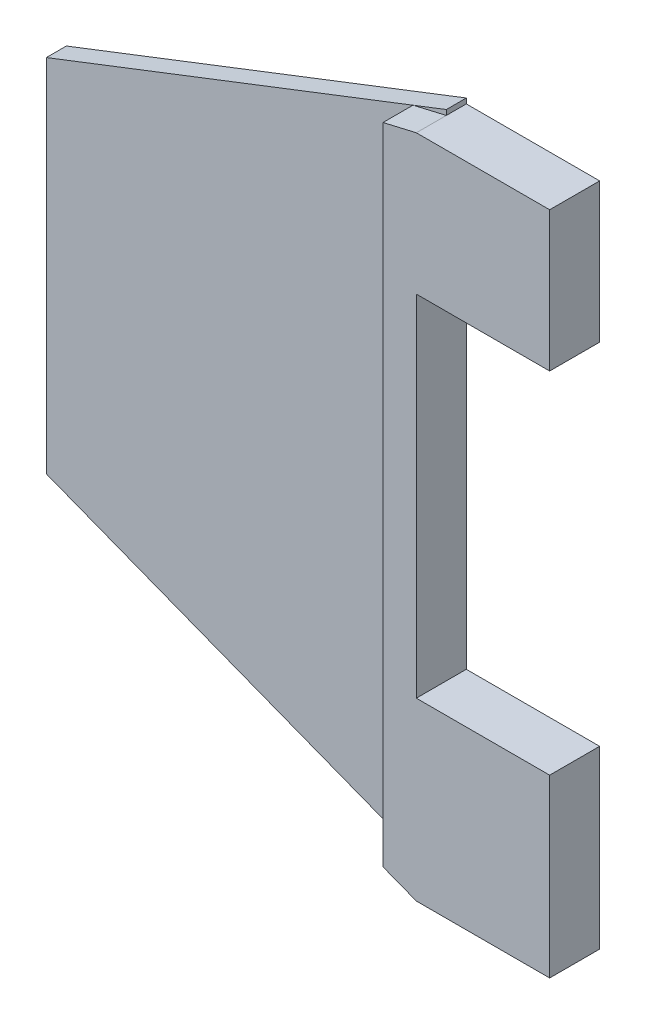
ISO-10303-21;
HEADER;
FILE_DESCRIPTION(('STEP AP214'),'2;1');
FILE_NAME('part.step','',(''),(''),'','','');
FILE_SCHEMA(('AUTOMOTIVE_DESIGN { 1 0 10303 214 1 1 1 1 }'));
ENDSEC;
DATA;
#1=APPLICATION_CONTEXT('core data for automotive mechanical design processes');
#2=APPLICATION_PROTOCOL_DEFINITION('international standard','automotive_design',2000,#1);
#3=PRODUCT_CONTEXT('',#1,'mechanical');
#4=PRODUCT('Part','Part','',(#3));
#5=PRODUCT_RELATED_PRODUCT_CATEGORY('part','',(#4));
#6=PRODUCT_DEFINITION_FORMATION('','',#4);
#7=PRODUCT_DEFINITION_CONTEXT('part definition',#1,'design');
#8=PRODUCT_DEFINITION('design','',#6,#7);
#9=PRODUCT_DEFINITION_SHAPE('','',#8);
#10=(LENGTH_UNIT() NAMED_UNIT(*) SI_UNIT(.MILLI.,.METRE.));
#11=(NAMED_UNIT(*) PLANE_ANGLE_UNIT() SI_UNIT($,.RADIAN.));
#12=(NAMED_UNIT(*) SI_UNIT($,.STERADIAN.) SOLID_ANGLE_UNIT());
#13=UNCERTAINTY_MEASURE_WITH_UNIT(LENGTH_MEASURE(1.E-05),#10,'distance_accuracy_value','');
#14=(GEOMETRIC_REPRESENTATION_CONTEXT(3) GLOBAL_UNCERTAINTY_ASSIGNED_CONTEXT((#13)) GLOBAL_UNIT_ASSIGNED_CONTEXT((#10,
#11,#12)) REPRESENTATION_CONTEXT('',''));
#15=CARTESIAN_POINT('',(0.,0.,0.));
#16=DIRECTION('',(0.,0.,1.));
#17=DIRECTION('',(1.,0.,0.));
#18=AXIS2_PLACEMENT_3D('',#15,#16,#17);
#19=CARTESIAN_POINT('',(24.8669295287806,20.098165537934,1.2));
#20=DIRECTION('',(1.,0.,0.));
#21=DIRECTION('',(0.,1.,0.));
#22=AXIS2_PLACEMENT_3D('',#19,#20,#21);
#23=PLANE('',#22);
#24=DIRECTION('',(0.,0.,-1.));
#25=VECTOR('',#24,1.);
#26=CARTESIAN_POINT('',(24.8669295287806,19.7895662368112,3.));
#27=LINE('',#26,#25);
#28=CARTESIAN_POINT('',(24.8669295287806,19.7895662368112,1.2));
#29=VERTEX_POINT('',#28);
#30=CARTESIAN_POINT('',(24.8669295287806,19.7895662368112,0.));
#31=VERTEX_POINT('',#30);
#32=EDGE_CURVE('E207',#29,#31,#27,.T.);
#33=ORIENTED_EDGE('',*,*,#32,.T.);
#34=DIRECTION('',(0.,-1.,0.));
#35=VECTOR('',#34,1.);
#36=CARTESIAN_POINT('',(24.8669295287806,20.098165537934,0.));
#37=LINE('',#36,#35);
#38=CARTESIAN_POINT('',(24.8669295287806,20.098165537934,0.));
#39=VERTEX_POINT('',#38);
#40=EDGE_CURVE('E240',#39,#31,#37,.T.);
#41=ORIENTED_EDGE('',*,*,#40,.F.);
#42=DIRECTION('',(0.,0.,-1.));
#43=VECTOR('',#42,1.);
#44=CARTESIAN_POINT('',(24.8669295287806,20.098165537934,1.2));
#45=LINE('',#44,#43);
#46=CARTESIAN_POINT('',(24.8669295287806,20.098165537934,1.2));
#47=VERTEX_POINT('',#46);
#48=EDGE_CURVE('E244',#47,#39,#45,.T.);
#49=ORIENTED_EDGE('',*,*,#48,.F.);
#50=DIRECTION('',(0.,-1.,0.));
#51=VECTOR('',#50,1.);
#52=CARTESIAN_POINT('',(24.8669295287806,20.098165537934,1.2));
#53=LINE('',#52,#51);
#54=EDGE_CURVE('E230',#47,#29,#53,.T.);
#55=ORIENTED_EDGE('',*,*,#54,.T.);
#56=EDGE_LOOP('',(#33,#41,#49,#55));
#57=FACE_BOUND('',#56,.T.);
#58=ADVANCED_FACE('F35',(#57),#23,.T.);
#59=CARTESIAN_POINT('',(0.,0.,1.2));
#60=DIRECTION('',(0.,0.,1.));
#61=DIRECTION('',(1.,0.,0.));
#62=AXIS2_PLACEMENT_3D('',#59,#60,#61);
#63=PLANE('',#62);
#64=DIRECTION('',(-0.973876556238657,-0.227078077340667,0.));
#65=VECTOR('',#64,1.);
#66=CARTESIAN_POINT('',(-3.09413410667259,13.2699056801782,1.2));
#67=LINE('',#66,#65);
#68=CARTESIAN_POINT('',(22.8669295287806,19.3232277139543,1.2));
#69=VERTEX_POINT('',#68);
#70=EDGE_CURVE('E224',#29,#69,#67,.T.);
#71=ORIENTED_EDGE('',*,*,#70,.F.);
#72=ORIENTED_EDGE('',*,*,#54,.F.);
#73=DIRECTION('',(0.932451231229654,0.361295864048156,0.));
#74=VECTOR('',#73,1.);
#75=CARTESIAN_POINT('',(0.866929528780555,10.7989116501775,1.2));
#76=LINE('',#75,#74);
#77=EDGE_CURVE('E233',#69,#47,#76,.T.);
#78=ORIENTED_EDGE('',*,*,#77,.F.);
#79=EDGE_LOOP('',(#71,#72,#78));
#80=FACE_BOUND('',#79,.T.);
#81=ADVANCED_FACE('F277',(#80),#63,.T.);
#82=CARTESIAN_POINT('',(0.866929528780555,10.7989116501775,1.2));
#83=DIRECTION('',(1.,0.,0.));
#84=DIRECTION('',(0.,0.,-1.));
#85=AXIS2_PLACEMENT_3D('',#82,#83,#84);
#86=PLANE('',#85);
#87=DIRECTION('',(0.,-1.,0.));
#88=VECTOR('',#87,1.);
#89=CARTESIAN_POINT('',(0.866929528780555,10.7989116501775,0.));
#90=LINE('',#89,#88);
#91=CARTESIAN_POINT('',(0.866929528780555,10.7989116501775,0.));
#92=VERTEX_POINT('',#91);
#93=CARTESIAN_POINT('',(0.866929528780555,-10.8337620445631,0.));
#94=VERTEX_POINT('',#93);
#95=EDGE_CURVE('E226',#92,#94,#90,.T.);
#96=ORIENTED_EDGE('',*,*,#95,.T.);
#97=DIRECTION('',(0.,0.,-1.));
#98=VECTOR('',#97,1.);
#99=CARTESIAN_POINT('',(0.866929528780555,-10.8337620445631,1.2));
#100=LINE('',#99,#98);
#101=CARTESIAN_POINT('',(0.866929528780555,-10.8337620445631,1.2));
#102=VERTEX_POINT('',#101);
#103=EDGE_CURVE('E11',#102,#94,#100,.T.);
#104=ORIENTED_EDGE('',*,*,#103,.F.);
#105=DIRECTION('',(0.,-1.,0.));
#106=VECTOR('',#105,1.);
#107=CARTESIAN_POINT('',(0.866929528780555,10.7989116501775,1.2));
#108=LINE('',#107,#106);
#109=CARTESIAN_POINT('',(0.866929528780555,10.7989116501775,1.2));
#110=VERTEX_POINT('',#109);
#111=EDGE_CURVE('E227',#110,#102,#108,.T.);
#112=ORIENTED_EDGE('',*,*,#111,.F.);
#113=DIRECTION('',(0.,0.,-1.));
#114=VECTOR('',#113,1.);
#115=CARTESIAN_POINT('',(0.866929528780555,10.7989116501775,1.2));
#116=LINE('',#115,#114);
#117=EDGE_CURVE('E52',#110,#92,#116,.T.);
#118=ORIENTED_EDGE('',*,*,#117,.T.);
#119=EDGE_LOOP('',(#96,#104,#112,#118));
#120=FACE_BOUND('',#119,.T.);
#121=ADVANCED_FACE('F37',(#120),#86,.F.);
#122=CARTESIAN_POINT('',(0.866929528780555,-10.8337620445631,1.2));
#123=DIRECTION('',(0.361295864048155,0.932451231229653,0.));
#124=DIRECTION('',(-0.932451231229654,0.361295864048155,0.));
#125=AXIS2_PLACEMENT_3D('',#122,#123,#124);
#126=PLANE('',#125);
#127=DIRECTION('',(0.932451231229654,-0.361295864048155,0.));
#128=VECTOR('',#127,1.);
#129=CARTESIAN_POINT('',(0.866929528780555,-10.8337620445631,0.));
#130=LINE('',#129,#128);
#131=CARTESIAN_POINT('',(24.8669295287806,-20.1330159323197,0.));
#132=VERTEX_POINT('',#131);
#133=EDGE_CURVE('E237',#94,#132,#130,.T.);
#134=ORIENTED_EDGE('',*,*,#133,.T.);
#135=DIRECTION('',(0.,0.,-1.));
#136=VECTOR('',#135,1.);
#137=CARTESIAN_POINT('',(24.8669295287806,-20.1330159323197,1.2));
#138=LINE('',#137,#136);
#139=CARTESIAN_POINT('',(24.8669295287806,-20.1330159323197,3.));
#140=VERTEX_POINT('',#139);
#141=EDGE_CURVE('E44',#140,#132,#138,.T.);
#142=ORIENTED_EDGE('',*,*,#141,.F.);
#143=DIRECTION('',(-0.932451231229653,0.361295864048156,0.));
#144=VECTOR('',#143,1.);
#145=CARTESIAN_POINT('',(22.8669295287806,-19.35807810834,3.));
#146=LINE('',#145,#144);
#147=CARTESIAN_POINT('',(22.8669295287806,-19.35807810834,3.));
#148=VERTEX_POINT('',#147);
#149=EDGE_CURVE('E187',#140,#148,#146,.T.);
#150=ORIENTED_EDGE('',*,*,#149,.T.);
#151=DIRECTION('',(0.,0.,-1.));
#152=VECTOR('',#151,1.);
#153=CARTESIAN_POINT('',(22.8669295287806,-19.35807810834,3.));
#154=LINE('',#153,#152);
#155=CARTESIAN_POINT('',(22.8669295287806,-19.35807810834,1.2));
#156=VERTEX_POINT('',#155);
#157=EDGE_CURVE('E211',#148,#156,#154,.T.);
#158=ORIENTED_EDGE('',*,*,#157,.T.);
#159=DIRECTION('',(0.932451231229654,-0.361295864048155,0.));
#160=VECTOR('',#159,1.);
#161=CARTESIAN_POINT('',(0.866929528780555,-10.8337620445631,1.2));
#162=LINE('',#161,#160);
#163=EDGE_CURVE('E75',#102,#156,#162,.T.);
#164=ORIENTED_EDGE('',*,*,#163,.F.);
#165=ORIENTED_EDGE('',*,*,#103,.T.);
#166=EDGE_LOOP('',(#134,#142,#150,#158,#164,#165));
#167=FACE_BOUND('',#166,.T.);
#168=ADVANCED_FACE('F259',(#167),#126,.F.);
#169=DIRECTION('',(0.,0.,-1.));
#170=VECTOR('',#169,1.);
#171=CARTESIAN_POINT('',(24.8669295287806,-9.59204114150225,3.));
#172=LINE('',#171,#170);
#173=CARTESIAN_POINT('',(24.8669295287806,-9.59204114150225,3.));
#174=VERTEX_POINT('',#173);
#175=CARTESIAN_POINT('',(24.8669295287806,-9.59204114150225,0.));
#176=VERTEX_POINT('',#175);
#177=EDGE_CURVE('E217',#174,#176,#172,.T.);
#178=ORIENTED_EDGE('',*,*,#177,.T.);
#179=CARTESIAN_POINT('',(24.8669295287806,11.4079588584978,0.));
#180=VERTEX_POINT('',#179);
#181=EDGE_CURVE('E239',#180,#176,#37,.T.);
#182=ORIENTED_EDGE('',*,*,#181,.F.);
#183=DIRECTION('',(0.,0.,-1.));
#184=VECTOR('',#183,1.);
#185=CARTESIAN_POINT('',(24.8669295287806,11.4079588584978,3.));
#186=LINE('',#185,#184);
#187=CARTESIAN_POINT('',(24.8669295287806,11.4079588584978,3.));
#188=VERTEX_POINT('',#187);
#189=EDGE_CURVE('E220',#188,#180,#186,.T.);
#190=ORIENTED_EDGE('',*,*,#189,.F.);
#191=DIRECTION('',(0.,-1.,0.));
#192=VECTOR('',#191,1.);
#193=CARTESIAN_POINT('',(24.8669295287806,-9.59204114150225,3.));
#194=LINE('',#193,#192);
#195=EDGE_CURVE('E175',#188,#174,#194,.T.);
#196=ORIENTED_EDGE('',*,*,#195,.T.);
#197=EDGE_LOOP('',(#178,#182,#190,#196));
#198=FACE_BOUND('',#197,.T.);
#199=ADVANCED_FACE('F285',(#198),#23,.T.);
#200=CARTESIAN_POINT('',(0.866929528780555,10.7989116501775,1.2));
#201=DIRECTION('',(-0.361295864048155,0.932451231229653,0.));
#202=DIRECTION('',(-0.932451231229654,-0.361295864048156,0.));
#203=AXIS2_PLACEMENT_3D('',#200,#201,#202);
#204=PLANE('',#203);
#205=EDGE_CURVE('E234',#110,#69,#76,.T.);
#206=ORIENTED_EDGE('',*,*,#205,.T.);
#207=ORIENTED_EDGE('',*,*,#77,.T.);
#208=ORIENTED_EDGE('',*,*,#48,.T.);
#209=DIRECTION('',(0.932451231229654,0.361295864048156,0.));
#210=VECTOR('',#209,1.);
#211=CARTESIAN_POINT('',(0.866929528780555,10.7989116501775,0.));
#212=LINE('',#211,#210);
#213=EDGE_CURVE('E67',#92,#39,#212,.T.);
#214=ORIENTED_EDGE('',*,*,#213,.F.);
#215=ORIENTED_EDGE('',*,*,#117,.F.);
#216=EDGE_LOOP('',(#206,#207,#208,#214,#215));
#217=FACE_BOUND('',#216,.T.);
#218=ADVANCED_FACE('F267',(#217),#204,.T.);
#219=DIRECTION('',(0.,-1.,0.));
#220=VECTOR('',#219,1.);
#221=CARTESIAN_POINT('',(22.8669295287806,0.,1.2));
#222=LINE('',#221,#220);
#223=EDGE_CURVE('E206',#69,#156,#222,.T.);
#224=ORIENTED_EDGE('',*,*,#223,.F.);
#225=ORIENTED_EDGE('',*,*,#205,.F.);
#226=ORIENTED_EDGE('',*,*,#111,.T.);
#227=ORIENTED_EDGE('',*,*,#163,.T.);
#228=EDGE_LOOP('',(#224,#225,#226,#227));
#229=FACE_BOUND('',#228,.T.);
#230=ADVANCED_FACE('F263',(#229),#63,.T.);
#231=CARTESIAN_POINT('',(0.,0.,0.));
#232=DIRECTION('',(0.,0.,1.));
#233=DIRECTION('',(1.,0.,0.));
#234=AXIS2_PLACEMENT_3D('',#231,#232,#233);
#235=PLANE('',#234);
#236=ORIENTED_EDGE('',*,*,#213,.T.);
#237=ORIENTED_EDGE('',*,*,#40,.T.);
#238=DIRECTION('',(1.,0.,0.));
#239=VECTOR('',#238,1.);
#240=CARTESIAN_POINT('',(32.8669295287806,19.7895662368112,0.));
#241=LINE('',#240,#239);
#242=CARTESIAN_POINT('',(32.8669295287806,19.7895662368112,0.));
#243=VERTEX_POINT('',#242);
#244=EDGE_CURVE('E194',#31,#243,#241,.T.);
#245=ORIENTED_EDGE('',*,*,#244,.T.);
#246=DIRECTION('',(0.,-1.,0.));
#247=VECTOR('',#246,1.);
#248=CARTESIAN_POINT('',(32.8669295287806,11.4079588584978,0.));
#249=LINE('',#248,#247);
#250=CARTESIAN_POINT('',(32.8669295287806,11.4079588584978,0.));
#251=VERTEX_POINT('',#250);
#252=EDGE_CURVE('E147',#243,#251,#249,.T.);
#253=ORIENTED_EDGE('',*,*,#252,.T.);
#254=DIRECTION('',(-1.,0.,0.));
#255=VECTOR('',#254,1.);
#256=CARTESIAN_POINT('',(32.8669295287806,11.4079588584978,0.));
#257=LINE('',#256,#255);
#258=EDGE_CURVE('E197',#251,#180,#257,.T.);
#259=ORIENTED_EDGE('',*,*,#258,.T.);
#260=ORIENTED_EDGE('',*,*,#181,.T.);
#261=DIRECTION('',(1.,0.,0.));
#262=VECTOR('',#261,1.);
#263=CARTESIAN_POINT('',(32.8669295287806,-9.59204114150225,0.));
#264=LINE('',#263,#262);
#265=CARTESIAN_POINT('',(32.8669295287806,-9.59204114150225,0.));
#266=VERTEX_POINT('',#265);
#267=EDGE_CURVE('E200',#176,#266,#264,.T.);
#268=ORIENTED_EDGE('',*,*,#267,.T.);
#269=DIRECTION('',(0.,-1.,0.));
#270=VECTOR('',#269,1.);
#271=CARTESIAN_POINT('',(32.8669295287806,-20.1330159323197,0.));
#272=LINE('',#271,#270);
#273=CARTESIAN_POINT('',(32.8669295287806,-20.1330159323197,0.));
#274=VERTEX_POINT('',#273);
#275=EDGE_CURVE('E171',#266,#274,#272,.T.);
#276=ORIENTED_EDGE('',*,*,#275,.T.);
#277=DIRECTION('',(-1.,0.,0.));
#278=VECTOR('',#277,1.);
#279=CARTESIAN_POINT('',(24.8669295287806,-20.1330159323197,0.));
#280=LINE('',#279,#278);
#281=EDGE_CURVE('E168',#274,#132,#280,.T.);
#282=ORIENTED_EDGE('',*,*,#281,.T.);
#283=ORIENTED_EDGE('',*,*,#133,.F.);
#284=ORIENTED_EDGE('',*,*,#95,.F.);
#285=EDGE_LOOP('',(#236,#237,#245,#253,#259,#260,#268,#276,#282,#283,#284));
#286=FACE_BOUND('',#285,.T.);
#287=ADVANCED_FACE('F251',(#286),#235,.F.);
#288=CARTESIAN_POINT('',(32.8669295287806,19.7895662368112,3.));
#289=DIRECTION('',(0.,1.,0.));
#290=DIRECTION('',(0.,0.,1.));
#291=AXIS2_PLACEMENT_3D('',#288,#289,#290);
#292=PLANE('',#291);
#293=ORIENTED_EDGE('',*,*,#244,.F.);
#294=ORIENTED_EDGE('',*,*,#32,.F.);
#295=CARTESIAN_POINT('',(24.8669295287806,19.7895662368112,3.));
#296=VERTEX_POINT('',#295);
#297=EDGE_CURVE('E167',#296,#29,#27,.T.);
#298=ORIENTED_EDGE('',*,*,#297,.F.);
#299=DIRECTION('',(1.,0.,0.));
#300=VECTOR('',#299,1.);
#301=CARTESIAN_POINT('',(32.8669295287806,19.7895662368112,3.));
#302=LINE('',#301,#300);
#303=CARTESIAN_POINT('',(32.8669295287806,19.7895662368112,3.));
#304=VERTEX_POINT('',#303);
#305=EDGE_CURVE('E159',#296,#304,#302,.T.);
#306=ORIENTED_EDGE('',*,*,#305,.T.);
#307=DIRECTION('',(0.,0.,-1.));
#308=VECTOR('',#307,1.);
#309=CARTESIAN_POINT('',(32.8669295287806,19.7895662368112,3.));
#310=LINE('',#309,#308);
#311=EDGE_CURVE('E142',#304,#243,#310,.T.);
#312=ORIENTED_EDGE('',*,*,#311,.T.);
#313=EDGE_LOOP('',(#293,#294,#298,#306,#312));
#314=FACE_BOUND('',#313,.T.);
#315=ADVANCED_FACE('F165',(#314),#292,.T.);
#316=CARTESIAN_POINT('',(24.8669295287806,19.7895662368112,3.));
#317=DIRECTION('',(-0.227078077340667,0.973876556238657,0.));
#318=DIRECTION('',(-0.973876556238657,-0.227078077340667,0.));
#319=AXIS2_PLACEMENT_3D('',#316,#317,#318);
#320=PLANE('',#319);
#321=ORIENTED_EDGE('',*,*,#297,.T.);
#322=ORIENTED_EDGE('',*,*,#70,.T.);
#323=DIRECTION('',(0.,0.,-1.));
#324=VECTOR('',#323,1.);
#325=CARTESIAN_POINT('',(22.8669295287806,19.3232277139543,3.));
#326=LINE('',#325,#324);
#327=CARTESIAN_POINT('',(22.8669295287806,19.3232277139543,3.));
#328=VERTEX_POINT('',#327);
#329=EDGE_CURVE('E208',#328,#69,#326,.T.);
#330=ORIENTED_EDGE('',*,*,#329,.F.);
#331=DIRECTION('',(0.973876556238657,0.227078077340667,0.));
#332=VECTOR('',#331,1.);
#333=CARTESIAN_POINT('',(24.8669295287806,19.7895662368112,3.));
#334=LINE('',#333,#332);
#335=EDGE_CURVE('E152',#328,#296,#334,.T.);
#336=ORIENTED_EDGE('',*,*,#335,.T.);
#337=EDGE_LOOP('',(#321,#322,#330,#336));
#338=FACE_BOUND('',#337,.T.);
#339=ADVANCED_FACE('F275',(#338),#320,.T.);
#340=CARTESIAN_POINT('',(22.8669295287806,19.3232277139543,3.));
#341=DIRECTION('',(-1.,0.,0.));
#342=DIRECTION('',(0.,-1.,0.));
#343=AXIS2_PLACEMENT_3D('',#340,#341,#342);
#344=PLANE('',#343);
#345=ORIENTED_EDGE('',*,*,#329,.T.);
#346=ORIENTED_EDGE('',*,*,#223,.T.);
#347=ORIENTED_EDGE('',*,*,#157,.F.);
#348=DIRECTION('',(0.,1.,0.));
#349=VECTOR('',#348,1.);
#350=CARTESIAN_POINT('',(22.8669295287806,19.3232277139543,3.));
#351=LINE('',#350,#349);
#352=EDGE_CURVE('E190',#148,#328,#351,.T.);
#353=ORIENTED_EDGE('',*,*,#352,.T.);
#354=EDGE_LOOP('',(#345,#346,#347,#353));
#355=FACE_BOUND('',#354,.T.);
#356=ADVANCED_FACE('F339',(#355),#344,.T.);
#357=CARTESIAN_POINT('',(24.8669295287806,-20.1330159323197,3.));
#358=DIRECTION('',(0.,-1.,0.));
#359=DIRECTION('',(0.,0.,-1.));
#360=AXIS2_PLACEMENT_3D('',#357,#358,#359);
#361=PLANE('',#360);
#362=ORIENTED_EDGE('',*,*,#281,.F.);
#363=DIRECTION('',(0.,0.,-1.));
#364=VECTOR('',#363,1.);
#365=CARTESIAN_POINT('',(32.8669295287806,-20.1330159323197,3.));
#366=LINE('',#365,#364);
#367=CARTESIAN_POINT('',(32.8669295287806,-20.1330159323197,3.));
#368=VERTEX_POINT('',#367);
#369=EDGE_CURVE('E213',#368,#274,#366,.T.);
#370=ORIENTED_EDGE('',*,*,#369,.F.);
#371=DIRECTION('',(-1.,0.,0.));
#372=VECTOR('',#371,1.);
#373=CARTESIAN_POINT('',(24.8669295287806,-20.1330159323197,3.));
#374=LINE('',#373,#372);
#375=EDGE_CURVE('E184',#368,#140,#374,.T.);
#376=ORIENTED_EDGE('',*,*,#375,.T.);
#377=ORIENTED_EDGE('',*,*,#141,.T.);
#378=EDGE_LOOP('',(#362,#370,#376,#377));
#379=FACE_BOUND('',#378,.T.);
#380=ADVANCED_FACE('F248',(#379),#361,.T.);
#381=CARTESIAN_POINT('',(32.8669295287806,-20.1330159323197,3.));
#382=DIRECTION('',(1.,0.,0.));
#383=DIRECTION('',(0.,0.,-1.));
#384=AXIS2_PLACEMENT_3D('',#381,#382,#383);
#385=PLANE('',#384);
#386=ORIENTED_EDGE('',*,*,#275,.F.);
#387=DIRECTION('',(0.,0.,-1.));
#388=VECTOR('',#387,1.);
#389=CARTESIAN_POINT('',(32.8669295287806,-9.59204114150225,3.));
#390=LINE('',#389,#388);
#391=CARTESIAN_POINT('',(32.8669295287806,-9.59204114150225,3.));
#392=VERTEX_POINT('',#391);
#393=EDGE_CURVE('E215',#392,#266,#390,.T.);
#394=ORIENTED_EDGE('',*,*,#393,.F.);
#395=DIRECTION('',(0.,-1.,0.));
#396=VECTOR('',#395,1.);
#397=CARTESIAN_POINT('',(32.8669295287806,-20.1330159323197,3.));
#398=LINE('',#397,#396);
#399=EDGE_CURVE('E181',#392,#368,#398,.T.);
#400=ORIENTED_EDGE('',*,*,#399,.T.);
#401=ORIENTED_EDGE('',*,*,#369,.T.);
#402=EDGE_LOOP('',(#386,#394,#400,#401));
#403=FACE_BOUND('',#402,.T.);
#404=ADVANCED_FACE('F255',(#403),#385,.T.);
#405=CARTESIAN_POINT('',(32.8669295287806,-9.59204114150225,3.));
#406=DIRECTION('',(0.,1.,0.));
#407=DIRECTION('',(0.,0.,1.));
#408=AXIS2_PLACEMENT_3D('',#405,#406,#407);
#409=PLANE('',#408);
#410=ORIENTED_EDGE('',*,*,#267,.F.);
#411=ORIENTED_EDGE('',*,*,#177,.F.);
#412=DIRECTION('',(1.,0.,0.));
#413=VECTOR('',#412,1.);
#414=CARTESIAN_POINT('',(32.8669295287806,-9.59204114150225,3.));
#415=LINE('',#414,#413);
#416=EDGE_CURVE('E178',#174,#392,#415,.T.);
#417=ORIENTED_EDGE('',*,*,#416,.T.);
#418=ORIENTED_EDGE('',*,*,#393,.T.);
#419=EDGE_LOOP('',(#410,#411,#417,#418));
#420=FACE_BOUND('',#419,.T.);
#421=ADVANCED_FACE('F364',(#420),#409,.T.);
#422=CARTESIAN_POINT('',(32.8669295287806,11.4079588584978,3.));
#423=DIRECTION('',(0.,-1.,0.));
#424=DIRECTION('',(0.,0.,-1.));
#425=AXIS2_PLACEMENT_3D('',#422,#423,#424);
#426=PLANE('',#425);
#427=ORIENTED_EDGE('',*,*,#258,.F.);
#428=DIRECTION('',(0.,0.,-1.));
#429=VECTOR('',#428,1.);
#430=CARTESIAN_POINT('',(32.8669295287806,11.4079588584978,3.));
#431=LINE('',#430,#429);
#432=CARTESIAN_POINT('',(32.8669295287806,11.4079588584978,3.));
#433=VERTEX_POINT('',#432);
#434=EDGE_CURVE('E151',#433,#251,#431,.T.);
#435=ORIENTED_EDGE('',*,*,#434,.F.);
#436=DIRECTION('',(-1.,0.,0.));
#437=VECTOR('',#436,1.);
#438=CARTESIAN_POINT('',(32.8669295287806,11.4079588584978,3.));
#439=LINE('',#438,#437);
#440=EDGE_CURVE('E163',#433,#188,#439,.T.);
#441=ORIENTED_EDGE('',*,*,#440,.T.);
#442=ORIENTED_EDGE('',*,*,#189,.T.);
#443=EDGE_LOOP('',(#427,#435,#441,#442));
#444=FACE_BOUND('',#443,.T.);
#445=ADVANCED_FACE('F373',(#444),#426,.T.);
#446=CARTESIAN_POINT('',(32.8669295287806,11.4079588584978,3.));
#447=DIRECTION('',(1.,0.,0.));
#448=DIRECTION('',(0.,0.,-1.));
#449=AXIS2_PLACEMENT_3D('',#446,#447,#448);
#450=PLANE('',#449);
#451=ORIENTED_EDGE('',*,*,#252,.F.);
#452=ORIENTED_EDGE('',*,*,#311,.F.);
#453=DIRECTION('',(0.,-1.,0.));
#454=VECTOR('',#453,1.);
#455=CARTESIAN_POINT('',(32.8669295287806,11.4079588584978,3.));
#456=LINE('',#455,#454);
#457=EDGE_CURVE('E145',#304,#433,#456,.T.);
#458=ORIENTED_EDGE('',*,*,#457,.T.);
#459=ORIENTED_EDGE('',*,*,#434,.T.);
#460=EDGE_LOOP('',(#451,#452,#458,#459));
#461=FACE_BOUND('',#460,.T.);
#462=ADVANCED_FACE('F144',(#461),#450,.T.);
#463=CARTESIAN_POINT('',(0.,0.,3.));
#464=DIRECTION('',(0.,0.,1.));
#465=DIRECTION('',(1.,0.,0.));
#466=AXIS2_PLACEMENT_3D('',#463,#464,#465);
#467=PLANE('',#466);
#468=ORIENTED_EDGE('',*,*,#305,.F.);
#469=ORIENTED_EDGE('',*,*,#335,.F.);
#470=ORIENTED_EDGE('',*,*,#352,.F.);
#471=ORIENTED_EDGE('',*,*,#149,.F.);
#472=ORIENTED_EDGE('',*,*,#375,.F.);
#473=ORIENTED_EDGE('',*,*,#399,.F.);
#474=ORIENTED_EDGE('',*,*,#416,.F.);
#475=ORIENTED_EDGE('',*,*,#195,.F.);
#476=ORIENTED_EDGE('',*,*,#440,.F.);
#477=ORIENTED_EDGE('',*,*,#457,.F.);
#478=EDGE_LOOP('',(#468,#469,#470,#471,#472,#473,#474,#475,#476,#477));
#479=FACE_BOUND('',#478,.T.);
#480=ADVANCED_FACE('F157',(#479),#467,.T.);
#481=CLOSED_SHELL('',(#58,#81,#121,#168,#199,#218,#230,#287,#315,#339,#356,#380,#404,#421,#445,
#462,#480));
#482=MANIFOLD_SOLID_BREP('B2',#481);
#483=ADVANCED_BREP_SHAPE_REPRESENTATION('',(#18,#482),#14);
#484=SHAPE_DEFINITION_REPRESENTATION(#9,#483);
ENDSEC;
END-ISO-10303-21;
